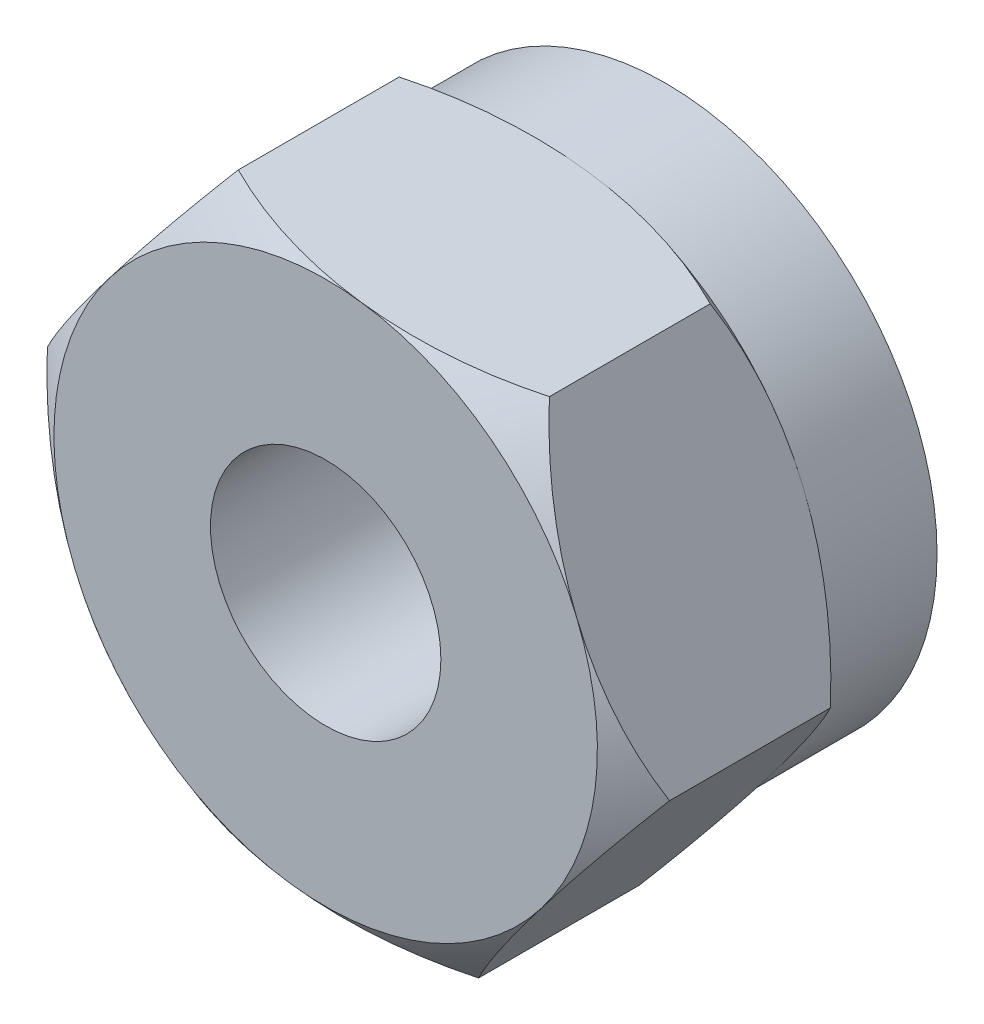
ISO-10303-21;
HEADER;
FILE_DESCRIPTION(('STEP AP214'),'2;1');
FILE_NAME('part.step','',(''),(''),'','','');
FILE_SCHEMA(('AUTOMOTIVE_DESIGN { 1 0 10303 214 1 1 1 1 }'));
ENDSEC;
DATA;
#1=APPLICATION_CONTEXT('core data for automotive mechanical design processes');
#2=APPLICATION_PROTOCOL_DEFINITION('international standard','automotive_design',2000,#1);
#3=PRODUCT_CONTEXT('',#1,'mechanical');
#4=PRODUCT('Part','Part','',(#3));
#5=PRODUCT_RELATED_PRODUCT_CATEGORY('part','',(#4));
#6=PRODUCT_DEFINITION_FORMATION('','',#4);
#7=PRODUCT_DEFINITION_CONTEXT('part definition',#1,'design');
#8=PRODUCT_DEFINITION('design','',#6,#7);
#9=PRODUCT_DEFINITION_SHAPE('','',#8);
#10=(LENGTH_UNIT() NAMED_UNIT(*) SI_UNIT(.MILLI.,.METRE.));
#11=(NAMED_UNIT(*) PLANE_ANGLE_UNIT() SI_UNIT($,.RADIAN.));
#12=(NAMED_UNIT(*) SI_UNIT($,.STERADIAN.) SOLID_ANGLE_UNIT());
#13=UNCERTAINTY_MEASURE_WITH_UNIT(LENGTH_MEASURE(1.E-05),#10,'distance_accuracy_value','');
#14=(GEOMETRIC_REPRESENTATION_CONTEXT(3) GLOBAL_UNCERTAINTY_ASSIGNED_CONTEXT((#13)) GLOBAL_UNIT_ASSIGNED_CONTEXT((#10,
#11,#12)) REPRESENTATION_CONTEXT('',''));
#15=CARTESIAN_POINT('',(0.,0.,0.));
#16=DIRECTION('',(0.,0.,1.));
#17=DIRECTION('',(1.,0.,0.));
#18=AXIS2_PLACEMENT_3D('',#15,#16,#17);
#19=CARTESIAN_POINT('',(100.965,15.875,89.6112));
#20=DIRECTION('',(0.,0.,1.));
#21=DIRECTION('',(1.,0.,0.));
#22=AXIS2_PLACEMENT_3D('',#19,#20,#21);
#23=CYLINDRICAL_SURFACE('',#22,4.7625);
#24=CARTESIAN_POINT('',(100.965,15.875,91.595575));
#25=DIRECTION('',(0.,0.,1.));
#26=DIRECTION('',(1.,0.,0.));
#27=AXIS2_PLACEMENT_3D('',#24,#25,#26);
#28=CIRCLE('',#27,4.7625);
#29=CARTESIAN_POINT('',(97.185507705602,18.7727308789096,91.5955750000004));
#30=VERTEX_POINT('',#29);
#31=CARTESIAN_POINT('',(96.5657452983347,14.0507290990988,91.5955749999999));
#32=VERTEX_POINT('',#31);
#33=EDGE_CURVE('E109',#30,#32,#28,.T.);
#34=ORIENTED_EDGE('',*,*,#33,.F.);
#35=CARTESIAN_POINT('',(100.965,15.875,91.5955749999999));
#36=DIRECTION('',(0.,0.,1.));
#37=DIRECTION('',(1.,0.,0.));
#38=AXIS2_PLACEMENT_3D('',#35,#36,#37);
#39=CIRCLE('',#38,4.7625);
#40=CARTESIAN_POINT('',(101.584762407267,20.597001779811,91.5955749999999));
#41=VERTEX_POINT('',#40);
#42=EDGE_CURVE('E21',#41,#30,#39,.T.);
#43=ORIENTED_EDGE('',*,*,#42,.F.);
#44=CARTESIAN_POINT('',(100.965,15.875,91.5955749999999));
#45=DIRECTION('',(0.,0.,1.));
#46=DIRECTION('',(1.,0.,0.));
#47=AXIS2_PLACEMENT_3D('',#44,#45,#46);
#48=CIRCLE('',#47,4.7625);
#49=CARTESIAN_POINT('',(105.364254701665,17.699270900901,91.5955749999999));
#50=VERTEX_POINT('',#49);
#51=EDGE_CURVE('E106',#50,#41,#48,.T.);
#52=ORIENTED_EDGE('',*,*,#51,.F.);
#53=CARTESIAN_POINT('',(100.965,15.875,91.5955749999999));
#54=DIRECTION('',(0.,0.,1.));
#55=DIRECTION('',(1.,0.,0.));
#56=AXIS2_PLACEMENT_3D('',#53,#54,#55);
#57=CIRCLE('',#56,4.7625);
#58=CARTESIAN_POINT('',(104.744492294398,12.9772691210902,91.5955750000001));
#59=VERTEX_POINT('',#58);
#60=EDGE_CURVE('E124',#59,#50,#57,.T.);
#61=ORIENTED_EDGE('',*,*,#60,.F.);
#62=CARTESIAN_POINT('',(100.965,15.875,91.5955749999999));
#63=DIRECTION('',(0.,0.,1.));
#64=DIRECTION('',(1.,0.,0.));
#65=AXIS2_PLACEMENT_3D('',#62,#63,#64);
#66=CIRCLE('',#65,4.7625);
#67=CARTESIAN_POINT('',(100.345237592732,11.152998220189,91.5955749999999));
#68=VERTEX_POINT('',#67);
#69=EDGE_CURVE('E143',#68,#59,#66,.T.);
#70=ORIENTED_EDGE('',*,*,#69,.F.);
#71=CARTESIAN_POINT('',(100.965,15.875,91.5955749999999));
#72=DIRECTION('',(0.,0.,1.));
#73=DIRECTION('',(1.,0.,0.));
#74=AXIS2_PLACEMENT_3D('',#71,#72,#73);
#75=CIRCLE('',#74,4.7625);
#76=EDGE_CURVE('E146',#32,#68,#75,.T.);
#77=ORIENTED_EDGE('',*,*,#76,.F.);
#78=EDGE_LOOP('',(#34,#43,#52,#61,#70,#77));
#79=FACE_BOUND('',#78,.T.);
#80=CARTESIAN_POINT('',(100.965,15.875,89.6112));
#81=DIRECTION('',(0.,0.,1.));
#82=DIRECTION('',(1.,0.,0.));
#83=AXIS2_PLACEMENT_3D('',#80,#81,#82);
#84=CIRCLE('',#83,4.7625);
#85=CARTESIAN_POINT('',(105.7275,15.875,89.6112));
#86=VERTEX_POINT('',#85);
#87=EDGE_CURVE('E123',#86,#86,#84,.F.);
#88=ORIENTED_EDGE('',*,*,#87,.F.);
#89=EDGE_LOOP('',(#88));
#90=FACE_BOUND('',#89,.T.);
#91=ADVANCED_FACE('F17',(#79,#90),#23,.T.);
#92=CARTESIAN_POINT('',(100.965,15.8750000000001,98.4609511730874));
#93=DIRECTION('',(1.,-1.27948482322159E-13,2.13765573872634E-13));
#94=DIRECTION('',(2.46636883678973E-13,0.387312185810854,-0.921948626943182));
#95=AXIS2_PLACEMENT_3D('',#92,#93,#94);
#96=SPHERICAL_SURFACE('',#95,8.35552489362552);
#97=CARTESIAN_POINT('',(101.584762407268,20.5970017798109,98.4609511730874));
#98=DIRECTION('',(0.13013383879634,0.991496436705714,0.));
#99=DIRECTION('',(-0.991496436705714,0.13013383879634,0.));
#100=AXIS2_PLACEMENT_3D('',#97,#98,#99);
#101=CIRCLE('',#100,6.86537617308745);
#102=CARTESIAN_POINT('',(98.8585134086061,20.9548217725148,92.1702500001053));
#103=VERTEX_POINT('',#102);
#104=EDGE_CURVE('E126',#41,#103,#101,.T.);
#105=ORIENTED_EDGE('',*,*,#104,.F.);
#106=ORIENTED_EDGE('',*,*,#42,.T.);
#107=CARTESIAN_POINT('',(97.1855077056022,18.7727308789098,98.4609511730874));
#108=DIRECTION('',(-0.793594182550728,0.608447428642477,0.));
#109=DIRECTION('',(-0.608447428642477,-0.793594182550728,0.));
#110=AXIS2_PLACEMENT_3D('',#107,#108,#109);
#111=CIRCLE('',#110,6.86537617308742);
#112=EDGE_CURVE('E129',#103,#30,#111,.T.);
#113=ORIENTED_EDGE('',*,*,#112,.F.);
#114=EDGE_LOOP('',(#105,#106,#113));
#115=FACE_BOUND('',#114,.T.);
#116=ADVANCED_FACE('F127',(#115),#96,.T.);
#117=CARTESIAN_POINT('',(100.964999999999,15.8749999999994,98.4609511730862));
#118=DIRECTION('',(1.,0.,0.));
#119=DIRECTION('',(0.,-0.260628814100176,-0.965439082107585));
#120=AXIS2_PLACEMENT_3D('',#117,#118,#119);
#121=SPHERICAL_SURFACE('',#120,8.35552489362398);
#122=CARTESIAN_POINT('',(97.1855077056016,18.772730878909,98.4609511730862));
#123=DIRECTION('',(-0.793594182550728,0.608447428642477,0.));
#124=DIRECTION('',(-0.608447428642477,-0.793594182550728,0.));
#125=AXIS2_PLACEMENT_3D('',#122,#123,#124);
#126=CIRCLE('',#125,6.86537617308567);
#127=CARTESIAN_POINT('',(95.5125020026318,16.5906399853218,92.1702500000784));
#128=VERTEX_POINT('',#127);
#129=EDGE_CURVE('E155',#30,#128,#126,.T.);
#130=ORIENTED_EDGE('',*,*,#129,.F.);
#131=ORIENTED_EDGE('',*,*,#33,.T.);
#132=CARTESIAN_POINT('',(96.5657452983348,14.0507290990986,98.4609511730862));
#133=DIRECTION('',(-0.923728021347068,-0.383049008063238,0.));
#134=DIRECTION('',(0.383049008063238,-0.923728021347068,0.));
#135=AXIS2_PLACEMENT_3D('',#132,#133,#134);
#136=CIRCLE('',#135,6.86537617308623);
#137=EDGE_CURVE('E153',#128,#32,#136,.T.);
#138=ORIENTED_EDGE('',*,*,#137,.F.);
#139=EDGE_LOOP('',(#130,#131,#138));
#140=FACE_BOUND('',#139,.T.);
#141=ADVANCED_FACE('F151',(#140),#121,.T.);
#142=CARTESIAN_POINT('',(100.965,15.875,98.4609511730876));
#143=DIRECTION('',(1.,0.,0.));
#144=DIRECTION('',(0.,-0.571719928567618,-0.820448854761001));
#145=AXIS2_PLACEMENT_3D('',#142,#143,#144);
#146=SPHERICAL_SURFACE('',#145,8.35552489362567);
#147=CARTESIAN_POINT('',(96.5657452983347,14.0507290990988,98.4609511730876));
#148=DIRECTION('',(-0.923728021347068,-0.383049008063238,0.));
#149=DIRECTION('',(0.383049008063238,-0.923728021347068,0.));
#150=AXIS2_PLACEMENT_3D('',#147,#148,#149);
#151=CIRCLE('',#150,6.86537617308764);
#152=CARTESIAN_POINT('',(97.6189885941001,11.5108182128512,92.170250000062));
#153=VERTEX_POINT('',#152);
#154=EDGE_CURVE('E158',#32,#153,#151,.T.);
#155=ORIENTED_EDGE('',*,*,#154,.F.);
#156=ORIENTED_EDGE('',*,*,#76,.T.);
#157=CARTESIAN_POINT('',(100.345237592732,11.1529982201889,98.4609511730876));
#158=DIRECTION('',(-0.13013383879634,-0.991496436705714,0.));
#159=DIRECTION('',(0.991496436705714,-0.13013383879634,0.));
#160=AXIS2_PLACEMENT_3D('',#157,#158,#159);
#161=CIRCLE('',#160,6.86537617308752);
#162=EDGE_CURVE('E162',#153,#68,#161,.T.);
#163=ORIENTED_EDGE('',*,*,#162,.F.);
#164=EDGE_LOOP('',(#155,#156,#163));
#165=FACE_BOUND('',#164,.T.);
#166=ADVANCED_FACE('F159',(#165),#146,.T.);
#167=CARTESIAN_POINT('',(100.965,15.8750000000001,98.4609511730876));
#168=DIRECTION('',(1.,0.,-1.1968299317276E-13));
#169=DIRECTION('',(-1.38086970370117E-13,-0.629558342021542,-0.776953212227794));
#170=AXIS2_PLACEMENT_3D('',#167,#168,#169);
#171=SPHERICAL_SURFACE('',#170,8.35552489362576);
#172=ORIENTED_EDGE('',*,*,#69,.T.);
#173=CARTESIAN_POINT('',(104.744492294398,12.9772691210902,98.4609511730876));
#174=DIRECTION('',(0.793594182550728,-0.608447428642477,0.));
#175=DIRECTION('',(0.608447428642477,0.793594182550728,0.));
#176=AXIS2_PLACEMENT_3D('',#173,#174,#175);
#177=CIRCLE('',#176,6.86537617308753);
#178=CARTESIAN_POINT('',(103.071486591454,10.7951782275636,92.1702500000622));
#179=VERTEX_POINT('',#178);
#180=EDGE_CURVE('E238',#179,#59,#177,.T.);
#181=ORIENTED_EDGE('',*,*,#180,.F.);
#182=CARTESIAN_POINT('',(100.345237592732,11.1529982201889,98.4609511730876));
#183=DIRECTION('',(-0.13013383879634,-0.991496436705714,0.));
#184=DIRECTION('',(0.991496436705714,-0.13013383879634,0.));
#185=AXIS2_PLACEMENT_3D('',#182,#183,#184);
#186=CIRCLE('',#185,6.86537617308755);
#187=EDGE_CURVE('E242',#68,#179,#186,.T.);
#188=ORIENTED_EDGE('',*,*,#187,.F.);
#189=EDGE_LOOP('',(#172,#181,#188));
#190=FACE_BOUND('',#189,.T.);
#191=ADVANCED_FACE('F270',(#190),#171,.T.);
#192=CARTESIAN_POINT('',(100.965,15.8749999999995,98.4609511730869));
#193=DIRECTION('',(1.,0.,0.));
#194=DIRECTION('',(0.,-0.392500402103346,-0.919751833022752));
#195=AXIS2_PLACEMENT_3D('',#192,#193,#194);
#196=SPHERICAL_SURFACE('',#195,8.35552489362478);
#197=ORIENTED_EDGE('',*,*,#60,.T.);
#198=CARTESIAN_POINT('',(105.364254701665,17.6992709009005,98.4609511730869));
#199=DIRECTION('',(0.923728021347068,0.383049008063238,0.));
#200=DIRECTION('',(-0.383049008063238,0.923728021347068,0.));
#201=AXIS2_PLACEMENT_3D('',#198,#199,#200);
#202=CIRCLE('',#201,6.86537617308686);
#203=CARTESIAN_POINT('',(106.417497997354,15.1593600147121,92.170250000062));
#204=VERTEX_POINT('',#203);
#205=EDGE_CURVE('E233',#204,#50,#202,.T.);
#206=ORIENTED_EDGE('',*,*,#205,.F.);
#207=CARTESIAN_POINT('',(104.744492294398,12.97726912109,98.4609511730869));
#208=DIRECTION('',(0.793594182550728,-0.608447428642477,0.));
#209=DIRECTION('',(0.608447428642477,0.793594182550728,0.));
#210=AXIS2_PLACEMENT_3D('',#207,#208,#209);
#211=CIRCLE('',#210,6.86537617308681);
#212=EDGE_CURVE('E236',#59,#204,#211,.T.);
#213=ORIENTED_EDGE('',*,*,#212,.F.);
#214=EDGE_LOOP('',(#197,#206,#213));
#215=FACE_BOUND('',#214,.T.);
#216=ADVANCED_FACE('F274',(#215),#196,.T.);
#217=CARTESIAN_POINT('',(100.965,15.8750000000001,98.4609511730878));
#218=DIRECTION('',(1.,0.,-1.73059102243725E-13));
#219=DIRECTION('',(-1.87736801000609E-13,0.254797211811612,-0.966994509215553));
#220=AXIS2_PLACEMENT_3D('',#217,#218,#219);
#221=SPHERICAL_SURFACE('',#220,8.35552489362584);
#222=ORIENTED_EDGE('',*,*,#51,.T.);
#223=CARTESIAN_POINT('',(101.584762407268,20.5970017798109,98.4609511730878));
#224=DIRECTION('',(0.13013383879634,0.991496436705714,0.));
#225=DIRECTION('',(-0.991496436705714,0.13013383879634,0.));
#226=AXIS2_PLACEMENT_3D('',#223,#224,#225);
#227=CIRCLE('',#226,6.86537617308788);
#228=CARTESIAN_POINT('',(104.311011405953,20.2391817871451,92.1702500000878));
#229=VERTEX_POINT('',#228);
#230=EDGE_CURVE('E118',#229,#41,#227,.T.);
#231=ORIENTED_EDGE('',*,*,#230,.F.);
#232=CARTESIAN_POINT('',(105.364254701665,17.6992709009011,98.4609511730878));
#233=DIRECTION('',(0.923728021347068,0.383049008063238,0.));
#234=DIRECTION('',(-0.383049008063238,0.923728021347068,0.));
#235=AXIS2_PLACEMENT_3D('',#232,#233,#234);
#236=CIRCLE('',#235,6.86537617308807);
#237=EDGE_CURVE('E121',#50,#229,#236,.T.);
#238=ORIENTED_EDGE('',*,*,#237,.F.);
#239=EDGE_LOOP('',(#222,#231,#238));
#240=FACE_BOUND('',#239,.T.);
#241=ADVANCED_FACE('F116',(#240),#221,.T.);
#242=CARTESIAN_POINT('',(100.965,15.875,89.6112));
#243=DIRECTION('',(0.,0.,-1.));
#244=DIRECTION('',(-1.,0.,0.));
#245=AXIS2_PLACEMENT_3D('',#242,#243,#244);
#246=PLANE('',#245);
#247=ORIENTED_EDGE('',*,*,#87,.T.);
#248=EDGE_LOOP('',(#247));
#249=FACE_BOUND('',#248,.T.);
#250=CARTESIAN_POINT('',(100.965,15.875,89.6112));
#251=DIRECTION('',(0.,0.,1.));
#252=DIRECTION('',(1.,0.,0.));
#253=AXIS2_PLACEMENT_3D('',#250,#251,#252);
#254=CIRCLE('',#253,2.01929999999999);
#255=CARTESIAN_POINT('',(102.9843,15.875,89.6112));
#256=VERTEX_POINT('',#255);
#257=EDGE_CURVE('E229',#256,#256,#254,.T.);
#258=ORIENTED_EDGE('',*,*,#257,.T.);
#259=EDGE_LOOP('',(#258));
#260=FACE_BOUND('',#259,.T.);
#261=ADVANCED_FACE('F282',(#249,#260),#246,.T.);
#262=CARTESIAN_POINT('',(101.584762407267,20.597001779811,93.57995));
#263=DIRECTION('',(0.13013383879634,0.991496436705714,0.));
#264=DIRECTION('',(-0.991496436705714,0.13013383879634,0.));
#265=AXIS2_PLACEMENT_3D('',#262,#263,#264);
#266=PLANE('',#265);
#267=CARTESIAN_POINT('',(101.584762407268,20.5970017798109,88.6989488269122));
#268=DIRECTION('',(0.13013383879634,0.991496436705714,0.));
#269=DIRECTION('',(-0.991496436705714,0.13013383879634,0.));
#270=AXIS2_PLACEMENT_3D('',#267,#268,#269);
#271=CIRCLE('',#270,6.86537617308778);
#272=CARTESIAN_POINT('',(101.584762407267,20.597001779811,95.564325));
#273=VERTEX_POINT('',#272);
#274=CARTESIAN_POINT('',(98.8585134086061,20.9548217725148,94.9896499998947));
#275=VERTEX_POINT('',#274);
#276=EDGE_CURVE('E220',#273,#275,#271,.F.);
#277=ORIENTED_EDGE('',*,*,#276,.F.);
#278=CARTESIAN_POINT('',(101.584762407268,20.5970017798109,88.6989488269126));
#279=DIRECTION('',(0.13013383879634,0.991496436705714,0.));
#280=DIRECTION('',(-0.991496436705714,0.13013383879634,0.));
#281=AXIS2_PLACEMENT_3D('',#278,#279,#280);
#282=CIRCLE('',#281,6.8653761730874);
#283=CARTESIAN_POINT('',(104.311011405953,20.2391817871451,94.9896499999121));
#284=VERTEX_POINT('',#283);
#285=EDGE_CURVE('E223',#284,#273,#282,.F.);
#286=ORIENTED_EDGE('',*,*,#285,.F.);
#287=DIRECTION('',(0.,0.,1.));
#288=VECTOR('',#287,1.);
#289=CARTESIAN_POINT('',(104.311011405952,20.2391817871487,93.57995));
#290=LINE('',#289,#288);
#291=EDGE_CURVE('E136',#229,#284,#290,.T.);
#292=ORIENTED_EDGE('',*,*,#291,.F.);
#293=ORIENTED_EDGE('',*,*,#230,.T.);
#294=ORIENTED_EDGE('',*,*,#104,.T.);
#295=DIRECTION('',(0.,0.,1.));
#296=VECTOR('',#295,1.);
#297=CARTESIAN_POINT('',(98.8585134086324,20.9548217725491,93.57995));
#298=LINE('',#297,#296);
#299=EDGE_CURVE('E132',#275,#103,#298,.F.);
#300=ORIENTED_EDGE('',*,*,#299,.F.);
#301=EDGE_LOOP('',(#277,#286,#292,#293,#294,#300));
#302=FACE_BOUND('',#301,.T.);
#303=ADVANCED_FACE('F134',(#302),#266,.T.);
#304=CARTESIAN_POINT('',(97.1855077056022,18.7727308789098,93.57995));
#305=DIRECTION('',(-0.793594182550728,0.608447428642477,0.));
#306=DIRECTION('',(-0.608447428642477,-0.793594182550728,0.));
#307=AXIS2_PLACEMENT_3D('',#304,#305,#306);
#308=PLANE('',#307);
#309=CARTESIAN_POINT('',(97.1855077056021,18.7727308789097,88.6989488269123));
#310=DIRECTION('',(-0.793594182550728,0.608447428642477,0.));
#311=DIRECTION('',(-0.608447428642477,-0.793594182550728,0.));
#312=AXIS2_PLACEMENT_3D('',#309,#310,#311);
#313=CIRCLE('',#312,6.86537617308766);
#314=CARTESIAN_POINT('',(97.185507705602,18.7727308789097,95.564325));
#315=VERTEX_POINT('',#314);
#316=CARTESIAN_POINT('',(95.5125020026318,16.5906399853218,94.9896499999219));
#317=VERTEX_POINT('',#316);
#318=EDGE_CURVE('E211',#315,#317,#313,.F.);
#319=ORIENTED_EDGE('',*,*,#318,.F.);
#320=CARTESIAN_POINT('',(97.185507705602,18.7727308789095,88.6989488269122));
#321=DIRECTION('',(-0.793594182550728,0.608447428642477,0.));
#322=DIRECTION('',(-0.608447428642477,-0.793594182550728,0.));
#323=AXIS2_PLACEMENT_3D('',#320,#321,#322);
#324=CIRCLE('',#323,6.86537617308785);
#325=EDGE_CURVE('E217',#275,#315,#324,.F.);
#326=ORIENTED_EDGE('',*,*,#325,.F.);
#327=ORIENTED_EDGE('',*,*,#299,.T.);
#328=ORIENTED_EDGE('',*,*,#112,.T.);
#329=ORIENTED_EDGE('',*,*,#129,.T.);
#330=DIRECTION('',(0.,0.,1.));
#331=VECTOR('',#330,1.);
#332=CARTESIAN_POINT('',(95.512502002639,16.5906399853045,93.57995));
#333=LINE('',#332,#331);
#334=EDGE_CURVE('E169',#317,#128,#333,.F.);
#335=ORIENTED_EDGE('',*,*,#334,.F.);
#336=EDGE_LOOP('',(#319,#326,#327,#328,#329,#335));
#337=FACE_BOUND('',#336,.T.);
#338=ADVANCED_FACE('F303',(#337),#308,.T.);
#339=CARTESIAN_POINT('',(96.5657452983347,14.0507290990988,93.57995));
#340=DIRECTION('',(-0.923728021347068,-0.383049008063238,0.));
#341=DIRECTION('',(0.383049008063238,-0.923728021347068,0.));
#342=AXIS2_PLACEMENT_3D('',#339,#340,#341);
#343=PLANE('',#342);
#344=CARTESIAN_POINT('',(96.5657452983347,14.0507290990989,88.6989488269121));
#345=DIRECTION('',(-0.923728021347068,-0.383049008063238,0.));
#346=DIRECTION('',(0.383049008063238,-0.923728021347068,0.));
#347=AXIS2_PLACEMENT_3D('',#344,#345,#346);
#348=CIRCLE('',#347,6.8653761730879);
#349=CARTESIAN_POINT('',(96.5657452983347,14.0507290990987,95.564325));
#350=VERTEX_POINT('',#349);
#351=CARTESIAN_POINT('',(97.6189885941001,11.5108182128512,94.989649999938));
#352=VERTEX_POINT('',#351);
#353=EDGE_CURVE('E208',#350,#352,#348,.F.);
#354=ORIENTED_EDGE('',*,*,#353,.F.);
#355=CARTESIAN_POINT('',(96.5657452983348,14.0507290990986,88.6989488269123));
#356=DIRECTION('',(-0.923728021347068,-0.383049008063238,0.));
#357=DIRECTION('',(0.383049008063238,-0.923728021347068,0.));
#358=AXIS2_PLACEMENT_3D('',#355,#356,#357);
#359=CIRCLE('',#358,6.86537617308784);
#360=EDGE_CURVE('E214',#317,#350,#359,.F.);
#361=ORIENTED_EDGE('',*,*,#360,.F.);
#362=ORIENTED_EDGE('',*,*,#334,.T.);
#363=ORIENTED_EDGE('',*,*,#137,.T.);
#364=ORIENTED_EDGE('',*,*,#154,.T.);
#365=DIRECTION('',(0.,0.,1.));
#366=VECTOR('',#365,1.);
#367=CARTESIAN_POINT('',(97.6189885941555,11.5108182128439,93.57995));
#368=LINE('',#367,#366);
#369=EDGE_CURVE('E165',#352,#153,#368,.F.);
#370=ORIENTED_EDGE('',*,*,#369,.F.);
#371=EDGE_LOOP('',(#354,#361,#362,#363,#364,#370));
#372=FACE_BOUND('',#371,.T.);
#373=ADVANCED_FACE('F167',(#372),#343,.T.);
#374=CARTESIAN_POINT('',(100.345237592732,11.152998220189,93.57995));
#375=DIRECTION('',(-0.13013383879634,-0.991496436705714,0.));
#376=DIRECTION('',(0.991496436705714,-0.13013383879634,0.));
#377=AXIS2_PLACEMENT_3D('',#374,#375,#376);
#378=PLANE('',#377);
#379=CARTESIAN_POINT('',(100.345237592732,11.1529982201889,88.6989488269123));
#380=DIRECTION('',(-0.13013383879634,-0.991496436705714,0.));
#381=DIRECTION('',(0.991496436705714,-0.13013383879634,0.));
#382=AXIS2_PLACEMENT_3D('',#379,#380,#381);
#383=CIRCLE('',#382,6.86537617308757);
#384=CARTESIAN_POINT('',(100.345237592732,11.152998220189,95.564325));
#385=VERTEX_POINT('',#384);
#386=CARTESIAN_POINT('',(103.071486591454,10.7951782275636,94.9896499999378));
#387=VERTEX_POINT('',#386);
#388=EDGE_CURVE('E202',#385,#387,#383,.F.);
#389=ORIENTED_EDGE('',*,*,#388,.F.);
#390=CARTESIAN_POINT('',(100.345237592733,11.1529982201889,88.6989488269121));
#391=DIRECTION('',(-0.13013383879634,-0.991496436705714,0.));
#392=DIRECTION('',(0.991496436705714,-0.13013383879634,0.));
#393=AXIS2_PLACEMENT_3D('',#390,#391,#392);
#394=CIRCLE('',#393,6.86537617308784);
#395=EDGE_CURVE('E205',#352,#385,#394,.F.);
#396=ORIENTED_EDGE('',*,*,#395,.F.);
#397=ORIENTED_EDGE('',*,*,#369,.T.);
#398=ORIENTED_EDGE('',*,*,#162,.T.);
#399=ORIENTED_EDGE('',*,*,#187,.T.);
#400=DIRECTION('',(0.,0.,1.));
#401=VECTOR('',#400,1.);
#402=CARTESIAN_POINT('',(103.071486591488,10.7951782276078,93.57995));
#403=LINE('',#402,#401);
#404=EDGE_CURVE('E241',#387,#179,#403,.F.);
#405=ORIENTED_EDGE('',*,*,#404,.F.);
#406=EDGE_LOOP('',(#389,#396,#397,#398,#399,#405));
#407=FACE_BOUND('',#406,.T.);
#408=ADVANCED_FACE('F268',(#407),#378,.T.);
#409=CARTESIAN_POINT('',(104.744492294398,12.9772691210902,93.57995));
#410=DIRECTION('',(0.793594182550728,-0.608447428642477,0.));
#411=DIRECTION('',(0.608447428642477,0.793594182550728,0.));
#412=AXIS2_PLACEMENT_3D('',#409,#410,#411);
#413=PLANE('',#412);
#414=CARTESIAN_POINT('',(104.744492294398,12.9772691210906,88.6989488269131));
#415=DIRECTION('',(0.793594182550728,-0.608447428642477,0.));
#416=DIRECTION('',(0.608447428642477,0.793594182550728,0.));
#417=AXIS2_PLACEMENT_3D('',#414,#415,#416);
#418=CIRCLE('',#417,6.86537617308637);
#419=CARTESIAN_POINT('',(104.744492294398,12.9772691210904,95.5643249999997));
#420=VERTEX_POINT('',#419);
#421=CARTESIAN_POINT('',(106.417497997354,15.1593600147121,94.9896499999379));
#422=VERTEX_POINT('',#421);
#423=EDGE_CURVE('E36',#420,#422,#418,.F.);
#424=ORIENTED_EDGE('',*,*,#423,.F.);
#425=CARTESIAN_POINT('',(104.744492294398,12.9772691210901,88.6989488269123));
#426=DIRECTION('',(0.793594182550728,-0.608447428642477,0.));
#427=DIRECTION('',(0.608447428642477,0.793594182550728,0.));
#428=AXIS2_PLACEMENT_3D('',#425,#426,#427);
#429=CIRCLE('',#428,6.86537617308755);
#430=EDGE_CURVE('E200',#387,#420,#429,.F.);
#431=ORIENTED_EDGE('',*,*,#430,.F.);
#432=ORIENTED_EDGE('',*,*,#404,.T.);
#433=ORIENTED_EDGE('',*,*,#180,.T.);
#434=ORIENTED_EDGE('',*,*,#212,.T.);
#435=DIRECTION('',(0.,0.,1.));
#436=VECTOR('',#435,1.);
#437=CARTESIAN_POINT('',(106.417497997332,15.1593600147638,93.57995));
#438=LINE('',#437,#436);
#439=EDGE_CURVE('E235',#422,#204,#438,.F.);
#440=ORIENTED_EDGE('',*,*,#439,.F.);
#441=EDGE_LOOP('',(#424,#431,#432,#433,#434,#440));
#442=FACE_BOUND('',#441,.T.);
#443=ADVANCED_FACE('F266',(#442),#413,.T.);
#444=CARTESIAN_POINT('',(105.364254701665,17.6992709009012,93.57995));
#445=DIRECTION('',(0.923728021347068,0.383049008063238,0.));
#446=DIRECTION('',(-0.383049008063238,0.923728021347068,0.));
#447=AXIS2_PLACEMENT_3D('',#444,#445,#446);
#448=PLANE('',#447);
#449=CARTESIAN_POINT('',(105.364254701665,17.6992709009013,88.6989488269126));
#450=DIRECTION('',(0.923728021347068,0.383049008063238,0.));
#451=DIRECTION('',(-0.383049008063238,0.923728021347068,0.));
#452=AXIS2_PLACEMENT_3D('',#449,#450,#451);
#453=CIRCLE('',#452,6.86537617308754);
#454=CARTESIAN_POINT('',(105.364254701665,17.6992709009013,95.5643250000001));
#455=VERTEX_POINT('',#454);
#456=EDGE_CURVE('E226',#455,#284,#453,.F.);
#457=ORIENTED_EDGE('',*,*,#456,.F.);
#458=CARTESIAN_POINT('',(105.364254701665,17.6992709009014,88.6989488269131));
#459=DIRECTION('',(0.923728021347068,0.383049008063238,0.));
#460=DIRECTION('',(-0.383049008063238,0.923728021347068,0.));
#461=AXIS2_PLACEMENT_3D('',#458,#459,#460);
#462=CIRCLE('',#461,6.86537617308715);
#463=EDGE_CURVE('E196',#422,#455,#462,.F.);
#464=ORIENTED_EDGE('',*,*,#463,.F.);
#465=ORIENTED_EDGE('',*,*,#439,.T.);
#466=ORIENTED_EDGE('',*,*,#205,.T.);
#467=ORIENTED_EDGE('',*,*,#237,.T.);
#468=ORIENTED_EDGE('',*,*,#291,.T.);
#469=EDGE_LOOP('',(#457,#464,#465,#466,#467,#468));
#470=FACE_BOUND('',#469,.T.);
#471=ADVANCED_FACE('F251',(#470),#448,.T.);
#472=CARTESIAN_POINT('',(100.965,15.875,95.564325));
#473=DIRECTION('',(0.,0.,1.));
#474=DIRECTION('',(1.,0.,0.));
#475=AXIS2_PLACEMENT_3D('',#472,#473,#474);
#476=CYLINDRICAL_SURFACE('',#475,2.01929999999999);
#477=CARTESIAN_POINT('',(100.965,15.875,95.564325));
#478=DIRECTION('',(0.,0.,1.));
#479=DIRECTION('',(1.,0.,0.));
#480=AXIS2_PLACEMENT_3D('',#477,#478,#479);
#481=CIRCLE('',#480,2.01929999999999);
#482=CARTESIAN_POINT('',(102.9843,15.875,95.564325));
#483=VERTEX_POINT('',#482);
#484=EDGE_CURVE('E193',#483,#483,#481,.F.);
#485=ORIENTED_EDGE('',*,*,#484,.F.);
#486=EDGE_LOOP('',(#485));
#487=FACE_BOUND('',#486,.T.);
#488=ORIENTED_EDGE('',*,*,#257,.F.);
#489=EDGE_LOOP('',(#488));
#490=FACE_BOUND('',#489,.T.);
#491=ADVANCED_FACE('F291',(#487,#490),#476,.F.);
#492=CARTESIAN_POINT('',(100.965,15.8750000000003,88.6989488269126));
#493=DIRECTION('',(1.,0.,0.));
#494=DIRECTION('',(0.,0.571719928573641,0.820448854756804));
#495=AXIS2_PLACEMENT_3D('',#492,#493,#494);
#496=SPHERICAL_SURFACE('',#495,8.35552489362533);
#497=ORIENTED_EDGE('',*,*,#285,.T.);
#498=CARTESIAN_POINT('',(100.965,15.8750000000003,95.564325));
#499=DIRECTION('',(0.,0.,1.));
#500=DIRECTION('',(1.,0.,0.));
#501=AXIS2_PLACEMENT_3D('',#498,#499,#500);
#502=CIRCLE('',#501,4.76249999999964);
#503=EDGE_CURVE('E190',#455,#273,#502,.T.);
#504=ORIENTED_EDGE('',*,*,#503,.F.);
#505=ORIENTED_EDGE('',*,*,#456,.T.);
#506=EDGE_LOOP('',(#497,#504,#505));
#507=FACE_BOUND('',#506,.T.);
#508=ADVANCED_FACE('F256',(#507),#496,.T.);
#509=CARTESIAN_POINT('',(100.965,15.8749999999995,88.6989488269122));
#510=DIRECTION('',(1.,0.,0.));
#511=DIRECTION('',(0.,0.629558342028705,0.77695321222199));
#512=AXIS2_PLACEMENT_3D('',#509,#510,#511);
#513=SPHERICAL_SURFACE('',#512,8.35552489362611);
#514=ORIENTED_EDGE('',*,*,#325,.T.);
#515=CARTESIAN_POINT('',(100.965,15.8749999999995,95.564325));
#516=DIRECTION('',(0.,0.,1.));
#517=DIRECTION('',(1.,0.,0.));
#518=AXIS2_PLACEMENT_3D('',#515,#516,#517);
#519=CIRCLE('',#518,4.7625000000005);
#520=EDGE_CURVE('E187',#273,#315,#519,.T.);
#521=ORIENTED_EDGE('',*,*,#520,.F.);
#522=ORIENTED_EDGE('',*,*,#276,.T.);
#523=EDGE_LOOP('',(#514,#521,#522));
#524=FACE_BOUND('',#523,.T.);
#525=ADVANCED_FACE('F398',(#524),#513,.T.);
#526=CARTESIAN_POINT('',(100.965,15.8749999999998,88.6989488269123));
#527=DIRECTION('',(1.,0.,0.));
#528=DIRECTION('',(0.,0.39250040210338,0.919751833022737));
#529=AXIS2_PLACEMENT_3D('',#526,#527,#528);
#530=SPHERICAL_SURFACE('',#529,8.35552489362588);
#531=CARTESIAN_POINT('',(100.965,15.8749999999998,95.564325));
#532=DIRECTION('',(0.,0.,1.));
#533=DIRECTION('',(1.,0.,0.));
#534=AXIS2_PLACEMENT_3D('',#531,#532,#533);
#535=CIRCLE('',#534,4.76250000000023);
#536=EDGE_CURVE('E184',#315,#350,#535,.T.);
#537=ORIENTED_EDGE('',*,*,#536,.F.);
#538=ORIENTED_EDGE('',*,*,#318,.T.);
#539=ORIENTED_EDGE('',*,*,#360,.T.);
#540=EDGE_LOOP('',(#537,#538,#539));
#541=FACE_BOUND('',#540,.T.);
#542=ADVANCED_FACE('F407',(#541),#530,.T.);
#543=CARTESIAN_POINT('',(100.965,15.8750000000001,88.6989488269121));
#544=DIRECTION('',(1.,0.,-1.4724121604312E-13));
#545=DIRECTION('',(1.59729216880335E-13,-0.254797211811602,0.966994509215556));
#546=AXIS2_PLACEMENT_3D('',#543,#544,#545);
#547=SPHERICAL_SURFACE('',#546,8.35552489362604);
#548=ORIENTED_EDGE('',*,*,#395,.T.);
#549=CARTESIAN_POINT('',(100.965,15.8750000000001,95.564325));
#550=DIRECTION('',(0.,0.,1.));
#551=DIRECTION('',(1.,0.,0.));
#552=AXIS2_PLACEMENT_3D('',#549,#550,#551);
#553=CIRCLE('',#552,4.76250000000017);
#554=EDGE_CURVE('E181',#350,#385,#553,.T.);
#555=ORIENTED_EDGE('',*,*,#554,.F.);
#556=ORIENTED_EDGE('',*,*,#353,.T.);
#557=EDGE_LOOP('',(#548,#555,#556));
#558=FACE_BOUND('',#557,.T.);
#559=ADVANCED_FACE('F417',(#558),#547,.T.);
#560=CARTESIAN_POINT('',(100.965,15.875,88.6989488269123));
#561=DIRECTION('',(1.,0.,-1.19682993167523E-13));
#562=DIRECTION('',(1.38086970364258E-13,-0.387312185810818,0.921948626943197));
#563=AXIS2_PLACEMENT_3D('',#560,#561,#562);
#564=SPHERICAL_SURFACE('',#563,8.35552489362575);
#565=ORIENTED_EDGE('',*,*,#430,.T.);
#566=CARTESIAN_POINT('',(100.965,15.875,95.564325));
#567=DIRECTION('',(0.,0.,1.));
#568=DIRECTION('',(1.,0.,0.));
#569=AXIS2_PLACEMENT_3D('',#566,#567,#568);
#570=CIRCLE('',#569,4.76249999999999);
#571=EDGE_CURVE('E27',#385,#420,#570,.T.);
#572=ORIENTED_EDGE('',*,*,#571,.F.);
#573=ORIENTED_EDGE('',*,*,#388,.T.);
#574=EDGE_LOOP('',(#565,#572,#573));
#575=FACE_BOUND('',#574,.T.);
#576=ADVANCED_FACE('F265',(#575),#564,.T.);
#577=CARTESIAN_POINT('',(100.965,15.8750000000006,88.6989488269131));
#578=DIRECTION('',(1.,0.,0.));
#579=DIRECTION('',(0.,0.260628814100185,0.965439082107582));
#580=AXIS2_PLACEMENT_3D('',#577,#578,#579);
#581=SPHERICAL_SURFACE('',#580,8.35552489362484);
#582=ORIENTED_EDGE('',*,*,#463,.T.);
#583=CARTESIAN_POINT('',(100.965,15.8750000000006,95.564325));
#584=DIRECTION('',(0.,0.,1.));
#585=DIRECTION('',(1.,0.,0.));
#586=AXIS2_PLACEMENT_3D('',#583,#584,#585);
#587=CIRCLE('',#586,4.7624999999995);
#588=EDGE_CURVE('E11',#420,#455,#587,.T.);
#589=ORIENTED_EDGE('',*,*,#588,.F.);
#590=ORIENTED_EDGE('',*,*,#423,.T.);
#591=EDGE_LOOP('',(#582,#589,#590));
#592=FACE_BOUND('',#591,.T.);
#593=ADVANCED_FACE('F19',(#592),#581,.T.);
#594=CARTESIAN_POINT('',(100.965,15.875,95.564325));
#595=DIRECTION('',(0.,0.,1.));
#596=DIRECTION('',(1.,0.,0.));
#597=AXIS2_PLACEMENT_3D('',#594,#595,#596);
#598=PLANE('',#597);
#599=ORIENTED_EDGE('',*,*,#571,.T.);
#600=ORIENTED_EDGE('',*,*,#588,.T.);
#601=ORIENTED_EDGE('',*,*,#503,.T.);
#602=ORIENTED_EDGE('',*,*,#520,.T.);
#603=ORIENTED_EDGE('',*,*,#536,.T.);
#604=ORIENTED_EDGE('',*,*,#554,.T.);
#605=EDGE_LOOP('',(#599,#600,#601,#602,#603,#604));
#606=FACE_BOUND('',#605,.T.);
#607=ORIENTED_EDGE('',*,*,#484,.T.);
#608=EDGE_LOOP('',(#607));
#609=FACE_BOUND('',#608,.T.);
#610=ADVANCED_FACE('F260',(#606,#609),#598,.T.);
#611=CLOSED_SHELL('',(#91,#116,#141,#166,#191,#216,#241,#261,#303,#338,#373,#408,#443,#471,#491,
#508,#525,#542,#559,#576,#593,#610));
#612=MANIFOLD_SOLID_BREP('B1',#611);
#613=ADVANCED_BREP_SHAPE_REPRESENTATION('',(#18,#612),#14);
#614=SHAPE_DEFINITION_REPRESENTATION(#9,#613);
ENDSEC;
END-ISO-10303-21;
